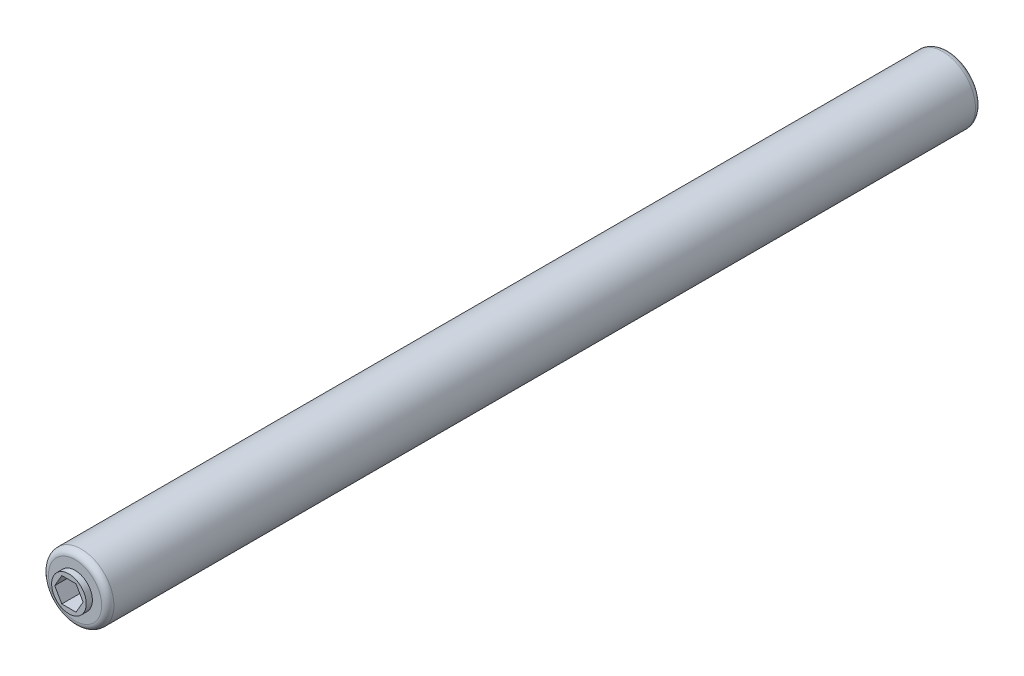
ISO-10303-21;
HEADER;
FILE_DESCRIPTION(('STEP AP214'),'2;1');
FILE_NAME('part.step','',(''),(''),'','','');
FILE_SCHEMA(('AUTOMOTIVE_DESIGN { 1 0 10303 214 1 1 1 1 }'));
ENDSEC;
DATA;
#1=APPLICATION_CONTEXT('core data for automotive mechanical design processes');
#2=APPLICATION_PROTOCOL_DEFINITION('international standard','automotive_design',2000,#1);
#3=PRODUCT_CONTEXT('',#1,'mechanical');
#4=PRODUCT('Part','Part','',(#3));
#5=PRODUCT_RELATED_PRODUCT_CATEGORY('part','',(#4));
#6=PRODUCT_DEFINITION_FORMATION('','',#4);
#7=PRODUCT_DEFINITION_CONTEXT('part definition',#1,'design');
#8=PRODUCT_DEFINITION('design','',#6,#7);
#9=PRODUCT_DEFINITION_SHAPE('','',#8);
#10=(LENGTH_UNIT() NAMED_UNIT(*) SI_UNIT(.MILLI.,.METRE.));
#11=(NAMED_UNIT(*) PLANE_ANGLE_UNIT() SI_UNIT($,.RADIAN.));
#12=(NAMED_UNIT(*) SI_UNIT($,.STERADIAN.) SOLID_ANGLE_UNIT());
#13=UNCERTAINTY_MEASURE_WITH_UNIT(LENGTH_MEASURE(1.E-05),#10,'distance_accuracy_value','');
#14=(GEOMETRIC_REPRESENTATION_CONTEXT(3) GLOBAL_UNCERTAINTY_ASSIGNED_CONTEXT((#13)) GLOBAL_UNIT_ASSIGNED_CONTEXT((#10,
#11,#12)) REPRESENTATION_CONTEXT('',''));
#15=CARTESIAN_POINT('',(0.,0.,0.));
#16=DIRECTION('',(0.,0.,1.));
#17=DIRECTION('',(1.,0.,0.));
#18=AXIS2_PLACEMENT_3D('',#15,#16,#17);
#19=CARTESIAN_POINT('',(0.,0.,-228.6));
#20=DIRECTION('',(0.,0.,1.));
#21=DIRECTION('',(1.,0.,0.));
#22=AXIS2_PLACEMENT_3D('',#19,#20,#21);
#23=PLANE('',#22);
#24=DIRECTION('',(1.,0.,0.));
#25=VECTOR('',#24,1.);
#26=CARTESIAN_POINT('',(-3.66617420935412,-6.35,-228.6));
#27=LINE('',#26,#25);
#28=CARTESIAN_POINT('',(-3.66617420935412,-6.35,-228.6));
#29=VERTEX_POINT('',#28);
#30=CARTESIAN_POINT('',(3.66617420935413,-6.35,-228.6));
#31=VERTEX_POINT('',#30);
#32=EDGE_CURVE('E100',#29,#31,#27,.T.);
#33=ORIENTED_EDGE('',*,*,#32,.T.);
#34=DIRECTION('',(0.5,0.866025403784439,0.));
#35=VECTOR('',#34,1.);
#36=CARTESIAN_POINT('',(3.66617420935413,-6.35,-228.6));
#37=LINE('',#36,#35);
#38=CARTESIAN_POINT('',(7.33234841870825,0.,-228.6));
#39=VERTEX_POINT('',#38);
#40=EDGE_CURVE('E94',#31,#39,#37,.T.);
#41=ORIENTED_EDGE('',*,*,#40,.T.);
#42=DIRECTION('',(-0.5,0.866025403784438,0.));
#43=VECTOR('',#42,1.);
#44=CARTESIAN_POINT('',(7.33234841870825,0.,-228.6));
#45=LINE('',#44,#43);
#46=CARTESIAN_POINT('',(3.66617420935412,6.35,-228.6));
#47=VERTEX_POINT('',#46);
#48=EDGE_CURVE('E103',#39,#47,#45,.T.);
#49=ORIENTED_EDGE('',*,*,#48,.T.);
#50=DIRECTION('',(-1.,0.,0.));
#51=VECTOR('',#50,1.);
#52=CARTESIAN_POINT('',(3.66617420935412,6.35,-228.6));
#53=LINE('',#52,#51);
#54=CARTESIAN_POINT('',(-3.66617420935412,6.35,-228.6));
#55=VERTEX_POINT('',#54);
#56=EDGE_CURVE('E54',#47,#55,#53,.T.);
#57=ORIENTED_EDGE('',*,*,#56,.T.);
#58=DIRECTION('',(-0.5,-0.866025403784439,0.));
#59=VECTOR('',#58,1.);
#60=CARTESIAN_POINT('',(-3.66617420935412,6.35,-228.6));
#61=LINE('',#60,#59);
#62=CARTESIAN_POINT('',(-7.33234841870825,0.,-228.6));
#63=VERTEX_POINT('',#62);
#64=EDGE_CURVE('E117',#55,#63,#61,.T.);
#65=ORIENTED_EDGE('',*,*,#64,.T.);
#66=DIRECTION('',(0.5,-0.866025403784439,0.));
#67=VECTOR('',#66,1.);
#68=CARTESIAN_POINT('',(-7.33234841870825,0.,-228.6));
#69=LINE('',#68,#67);
#70=EDGE_CURVE('E120',#63,#29,#69,.T.);
#71=ORIENTED_EDGE('',*,*,#70,.T.);
#72=EDGE_LOOP('',(#33,#41,#49,#57,#65,#71));
#73=FACE_BOUND('',#72,.T.);
#74=CARTESIAN_POINT('',(0.,0.,-228.6));
#75=DIRECTION('',(0.,0.,1.));
#76=DIRECTION('',(1.,0.,0.));
#77=AXIS2_PLACEMENT_3D('',#74,#75,#76);
#78=CIRCLE('',#77,8.9296875);
#79=CARTESIAN_POINT('',(8.9296875,0.,-228.6));
#80=VERTEX_POINT('',#79);
#81=EDGE_CURVE('E148',#80,#80,#78,.T.);
#82=ORIENTED_EDGE('',*,*,#81,.F.);
#83=EDGE_LOOP('',(#82));
#84=FACE_BOUND('',#83,.T.);
#85=ADVANCED_FACE('F39',(#73,#84),#23,.F.);
#86=CARTESIAN_POINT('',(0.,0.,0.));
#87=DIRECTION('',(0.,0.,1.));
#88=DIRECTION('',(1.,0.,0.));
#89=AXIS2_PLACEMENT_3D('',#86,#87,#88);
#90=CYLINDRICAL_SURFACE('',#89,8.9296875);
#91=CARTESIAN_POINT('',(0.,0.,-225.425));
#92=DIRECTION('',(0.,0.,1.));
#93=DIRECTION('',(1.,0.,0.));
#94=AXIS2_PLACEMENT_3D('',#91,#92,#93);
#95=CIRCLE('',#94,8.9296875);
#96=CARTESIAN_POINT('',(8.9296875,0.,-225.425));
#97=VERTEX_POINT('',#96);
#98=EDGE_CURVE('E136',#97,#97,#95,.T.);
#99=ORIENTED_EDGE('',*,*,#98,.F.);
#100=EDGE_LOOP('',(#99));
#101=FACE_BOUND('',#100,.T.);
#102=ORIENTED_EDGE('',*,*,#81,.T.);
#103=EDGE_LOOP('',(#102));
#104=FACE_BOUND('',#103,.T.);
#105=ADVANCED_FACE('F190',(#101,#104),#90,.T.);
#106=CARTESIAN_POINT('',(16.8671875,0.,-225.425));
#107=DIRECTION('',(0.,0.,1.));
#108=DIRECTION('',(1.,0.,0.));
#109=AXIS2_PLACEMENT_3D('',#106,#107,#108);
#110=PLANE('',#109);
#111=CARTESIAN_POINT('',(0.,0.,-225.425));
#112=DIRECTION('',(0.,0.,1.));
#113=DIRECTION('',(1.,0.,0.));
#114=AXIS2_PLACEMENT_3D('',#111,#112,#113);
#115=CIRCLE('',#114,13.6921875);
#116=CARTESIAN_POINT('',(13.6921875,0.,-225.425));
#117=VERTEX_POINT('',#116);
#118=EDGE_CURVE('E11',#117,#117,#115,.F.);
#119=ORIENTED_EDGE('',*,*,#118,.T.);
#120=EDGE_LOOP('',(#119));
#121=FACE_BOUND('',#120,.T.);
#122=ORIENTED_EDGE('',*,*,#98,.T.);
#123=EDGE_LOOP('',(#122));
#124=FACE_BOUND('',#123,.T.);
#125=ADVANCED_FACE('F195',(#121,#124),#110,.F.);
#126=CARTESIAN_POINT('',(0.,0.,228.6));
#127=DIRECTION('',(0.,0.,-1.));
#128=DIRECTION('',(-1.,0.,0.));
#129=AXIS2_PLACEMENT_3D('',#126,#127,#128);
#130=CYLINDRICAL_SURFACE('',#129,16.8671875);
#131=CARTESIAN_POINT('',(0.,0.,222.25));
#132=DIRECTION('',(0.,0.,-1.));
#133=DIRECTION('',(-1.,0.,0.));
#134=AXIS2_PLACEMENT_3D('',#131,#132,#133);
#135=CIRCLE('',#134,16.8671875);
#136=CARTESIAN_POINT('',(-16.8671875,0.,222.25));
#137=VERTEX_POINT('',#136);
#138=EDGE_CURVE('E47',#137,#137,#135,.T.);
#139=ORIENTED_EDGE('',*,*,#138,.T.);
#140=EDGE_LOOP('',(#139));
#141=FACE_BOUND('',#140,.T.);
#142=CARTESIAN_POINT('',(0.,0.,-222.25));
#143=DIRECTION('',(0.,0.,1.));
#144=DIRECTION('',(1.,0.,0.));
#145=AXIS2_PLACEMENT_3D('',#142,#143,#144);
#146=CIRCLE('',#145,16.8671875);
#147=CARTESIAN_POINT('',(16.8671875,0.,-222.25));
#148=VERTEX_POINT('',#147);
#149=EDGE_CURVE('E158',#148,#148,#146,.T.);
#150=ORIENTED_EDGE('',*,*,#149,.T.);
#151=EDGE_LOOP('',(#150));
#152=FACE_BOUND('',#151,.T.);
#153=ADVANCED_FACE('F163',(#141,#152),#130,.T.);
#154=CARTESIAN_POINT('',(16.8671875,0.,225.425));
#155=DIRECTION('',(0.,0.,-1.));
#156=DIRECTION('',(-1.,0.,0.));
#157=AXIS2_PLACEMENT_3D('',#154,#155,#156);
#158=PLANE('',#157);
#159=CARTESIAN_POINT('',(0.,0.,225.425));
#160=DIRECTION('',(0.,0.,-1.));
#161=DIRECTION('',(-1.,0.,0.));
#162=AXIS2_PLACEMENT_3D('',#159,#160,#161);
#163=CIRCLE('',#162,13.6921875);
#164=CARTESIAN_POINT('',(-13.6921875,0.,225.425));
#165=VERTEX_POINT('',#164);
#166=EDGE_CURVE('E151',#165,#165,#163,.F.);
#167=ORIENTED_EDGE('',*,*,#166,.T.);
#168=EDGE_LOOP('',(#167));
#169=FACE_BOUND('',#168,.T.);
#170=CARTESIAN_POINT('',(0.,0.,225.425));
#171=DIRECTION('',(0.,0.,1.));
#172=DIRECTION('',(1.,0.,0.));
#173=AXIS2_PLACEMENT_3D('',#170,#171,#172);
#174=CIRCLE('',#173,8.9296875);
#175=CARTESIAN_POINT('',(8.9296875,0.,225.425));
#176=VERTEX_POINT('',#175);
#177=EDGE_CURVE('E147',#176,#176,#174,.T.);
#178=ORIENTED_EDGE('',*,*,#177,.F.);
#179=EDGE_LOOP('',(#178));
#180=FACE_BOUND('',#179,.T.);
#181=ADVANCED_FACE('F172',(#169,#180),#158,.F.);
#182=CARTESIAN_POINT('',(0.,0.,0.));
#183=DIRECTION('',(0.,0.,1.));
#184=DIRECTION('',(1.,0.,0.));
#185=AXIS2_PLACEMENT_3D('',#182,#183,#184);
#186=CYLINDRICAL_SURFACE('',#185,8.9296875);
#187=CARTESIAN_POINT('',(0.,0.,228.6));
#188=DIRECTION('',(0.,0.,1.));
#189=DIRECTION('',(1.,0.,0.));
#190=AXIS2_PLACEMENT_3D('',#187,#188,#189);
#191=CIRCLE('',#190,8.9296875);
#192=CARTESIAN_POINT('',(8.9296875,0.,228.6));
#193=VERTEX_POINT('',#192);
#194=EDGE_CURVE('E144',#193,#193,#191,.T.);
#195=ORIENTED_EDGE('',*,*,#194,.F.);
#196=EDGE_LOOP('',(#195));
#197=FACE_BOUND('',#196,.T.);
#198=ORIENTED_EDGE('',*,*,#177,.T.);
#199=EDGE_LOOP('',(#198));
#200=FACE_BOUND('',#199,.T.);
#201=ADVANCED_FACE('F175',(#197,#200),#186,.T.);
#202=CARTESIAN_POINT('',(0.,0.,228.6));
#203=DIRECTION('',(0.,0.,1.));
#204=DIRECTION('',(1.,0.,0.));
#205=AXIS2_PLACEMENT_3D('',#202,#203,#204);
#206=PLANE('',#205);
#207=DIRECTION('',(0.5,0.866025403784439,0.));
#208=VECTOR('',#207,1.);
#209=CARTESIAN_POINT('',(3.66617420935413,-6.35,228.6));
#210=LINE('',#209,#208);
#211=CARTESIAN_POINT('',(3.66617420935413,-6.35,228.6));
#212=VERTEX_POINT('',#211);
#213=CARTESIAN_POINT('',(7.33234841870825,0.,228.6));
#214=VERTEX_POINT('',#213);
#215=EDGE_CURVE('E62',#212,#214,#210,.T.);
#216=ORIENTED_EDGE('',*,*,#215,.F.);
#217=DIRECTION('',(1.,0.,0.));
#218=VECTOR('',#217,1.);
#219=CARTESIAN_POINT('',(-3.66617420935412,-6.35,228.6));
#220=LINE('',#219,#218);
#221=CARTESIAN_POINT('',(-3.66617420935412,-6.35,228.6));
#222=VERTEX_POINT('',#221);
#223=EDGE_CURVE('E110',#222,#212,#220,.T.);
#224=ORIENTED_EDGE('',*,*,#223,.F.);
#225=DIRECTION('',(0.5,-0.866025403784439,0.));
#226=VECTOR('',#225,1.);
#227=CARTESIAN_POINT('',(-7.33234841870825,0.,228.6));
#228=LINE('',#227,#226);
#229=CARTESIAN_POINT('',(-7.33234841870825,0.,228.6));
#230=VERTEX_POINT('',#229);
#231=EDGE_CURVE('E113',#230,#222,#228,.T.);
#232=ORIENTED_EDGE('',*,*,#231,.F.);
#233=DIRECTION('',(-0.5,-0.866025403784439,0.));
#234=VECTOR('',#233,1.);
#235=CARTESIAN_POINT('',(-3.66617420935412,6.35,228.6));
#236=LINE('',#235,#234);
#237=CARTESIAN_POINT('',(-3.66617420935412,6.35,228.6));
#238=VERTEX_POINT('',#237);
#239=EDGE_CURVE('E129',#238,#230,#236,.T.);
#240=ORIENTED_EDGE('',*,*,#239,.F.);
#241=DIRECTION('',(-1.,0.,0.));
#242=VECTOR('',#241,1.);
#243=CARTESIAN_POINT('',(3.66617420935412,6.35,228.6));
#244=LINE('',#243,#242);
#245=CARTESIAN_POINT('',(3.66617420935412,6.35,228.6));
#246=VERTEX_POINT('',#245);
#247=EDGE_CURVE('E126',#246,#238,#244,.T.);
#248=ORIENTED_EDGE('',*,*,#247,.F.);
#249=DIRECTION('',(-0.5,0.866025403784438,0.));
#250=VECTOR('',#249,1.);
#251=CARTESIAN_POINT('',(7.33234841870825,0.,228.6));
#252=LINE('',#251,#250);
#253=EDGE_CURVE('E124',#214,#246,#252,.T.);
#254=ORIENTED_EDGE('',*,*,#253,.F.);
#255=EDGE_LOOP('',(#216,#224,#232,#240,#248,#254));
#256=FACE_BOUND('',#255,.T.);
#257=ORIENTED_EDGE('',*,*,#194,.T.);
#258=EDGE_LOOP('',(#257));
#259=FACE_BOUND('',#258,.T.);
#260=ADVANCED_FACE('F169',(#256,#259),#206,.T.);
#261=CARTESIAN_POINT('',(0.,0.,222.25));
#262=DIRECTION('',(0.,0.,-1.));
#263=DIRECTION('',(-1.,0.,0.));
#264=AXIS2_PLACEMENT_3D('',#261,#262,#263);
#265=TOROIDAL_SURFACE('',#264,13.6921875,3.175);
#266=ORIENTED_EDGE('',*,*,#138,.F.);
#267=EDGE_LOOP('',(#266));
#268=FACE_BOUND('',#267,.T.);
#269=ORIENTED_EDGE('',*,*,#166,.F.);
#270=EDGE_LOOP('',(#269));
#271=FACE_BOUND('',#270,.T.);
#272=ADVANCED_FACE('F166',(#268,#271),#265,.T.);
#273=CARTESIAN_POINT('',(0.,0.,-222.25));
#274=DIRECTION('',(0.,0.,1.));
#275=DIRECTION('',(1.,0.,0.));
#276=AXIS2_PLACEMENT_3D('',#273,#274,#275);
#277=TOROIDAL_SURFACE('',#276,13.6921875,3.175);
#278=ORIENTED_EDGE('',*,*,#118,.F.);
#279=EDGE_LOOP('',(#278));
#280=FACE_BOUND('',#279,.T.);
#281=ORIENTED_EDGE('',*,*,#149,.F.);
#282=EDGE_LOOP('',(#281));
#283=FACE_BOUND('',#282,.T.);
#284=ADVANCED_FACE('F41',(#280,#283),#277,.T.);
#285=CARTESIAN_POINT('',(3.66617420935413,-6.35,-228.6));
#286=DIRECTION('',(0.866025403784439,-0.5,0.));
#287=DIRECTION('',(0.5,0.866025403784439,0.));
#288=AXIS2_PLACEMENT_3D('',#285,#286,#287);
#289=PLANE('',#288);
#290=ORIENTED_EDGE('',*,*,#215,.T.);
#291=DIRECTION('',(0.,0.,1.));
#292=VECTOR('',#291,1.);
#293=CARTESIAN_POINT('',(7.33234841870825,0.,-228.6));
#294=LINE('',#293,#292);
#295=EDGE_CURVE('E90',#39,#214,#294,.T.);
#296=ORIENTED_EDGE('',*,*,#295,.F.);
#297=ORIENTED_EDGE('',*,*,#40,.F.);
#298=DIRECTION('',(0.,0.,1.));
#299=VECTOR('',#298,1.);
#300=CARTESIAN_POINT('',(3.66617420935413,-6.35,-228.6));
#301=LINE('',#300,#299);
#302=EDGE_CURVE('E134',#31,#212,#301,.T.);
#303=ORIENTED_EDGE('',*,*,#302,.T.);
#304=EDGE_LOOP('',(#290,#296,#297,#303));
#305=FACE_BOUND('',#304,.T.);
#306=ADVANCED_FACE('F92',(#305),#289,.F.);
#307=CARTESIAN_POINT('',(-3.66617420935412,-6.35,-228.6));
#308=DIRECTION('',(0.,-1.,0.));
#309=DIRECTION('',(1.,0.,0.));
#310=AXIS2_PLACEMENT_3D('',#307,#308,#309);
#311=PLANE('',#310);
#312=ORIENTED_EDGE('',*,*,#223,.T.);
#313=ORIENTED_EDGE('',*,*,#302,.F.);
#314=ORIENTED_EDGE('',*,*,#32,.F.);
#315=DIRECTION('',(0.,0.,1.));
#316=VECTOR('',#315,1.);
#317=CARTESIAN_POINT('',(-3.66617420935412,-6.35,-228.6));
#318=LINE('',#317,#316);
#319=EDGE_CURVE('E137',#29,#222,#318,.T.);
#320=ORIENTED_EDGE('',*,*,#319,.T.);
#321=EDGE_LOOP('',(#312,#313,#314,#320));
#322=FACE_BOUND('',#321,.T.);
#323=ADVANCED_FACE('F219',(#322),#311,.F.);
#324=CARTESIAN_POINT('',(-7.33234841870825,0.,-228.6));
#325=DIRECTION('',(-0.866025403784439,-0.5,0.));
#326=DIRECTION('',(0.5,-0.866025403784439,0.));
#327=AXIS2_PLACEMENT_3D('',#324,#325,#326);
#328=PLANE('',#327);
#329=ORIENTED_EDGE('',*,*,#231,.T.);
#330=ORIENTED_EDGE('',*,*,#319,.F.);
#331=ORIENTED_EDGE('',*,*,#70,.F.);
#332=DIRECTION('',(0.,0.,1.));
#333=VECTOR('',#332,1.);
#334=CARTESIAN_POINT('',(-7.33234841870825,0.,-228.6));
#335=LINE('',#334,#333);
#336=EDGE_CURVE('E139',#63,#230,#335,.T.);
#337=ORIENTED_EDGE('',*,*,#336,.T.);
#338=EDGE_LOOP('',(#329,#330,#331,#337));
#339=FACE_BOUND('',#338,.T.);
#340=ADVANCED_FACE('F223',(#339),#328,.F.);
#341=CARTESIAN_POINT('',(-3.66617420935412,6.35,-228.6));
#342=DIRECTION('',(-0.866025403784439,0.5,0.));
#343=DIRECTION('',(-0.5,-0.866025403784439,0.));
#344=AXIS2_PLACEMENT_3D('',#341,#342,#343);
#345=PLANE('',#344);
#346=ORIENTED_EDGE('',*,*,#239,.T.);
#347=ORIENTED_EDGE('',*,*,#336,.F.);
#348=ORIENTED_EDGE('',*,*,#64,.F.);
#349=DIRECTION('',(0.,0.,1.));
#350=VECTOR('',#349,1.);
#351=CARTESIAN_POINT('',(-3.66617420935412,6.35,-228.6));
#352=LINE('',#351,#350);
#353=EDGE_CURVE('E141',#55,#238,#352,.T.);
#354=ORIENTED_EDGE('',*,*,#353,.T.);
#355=EDGE_LOOP('',(#346,#347,#348,#354));
#356=FACE_BOUND('',#355,.T.);
#357=ADVANCED_FACE('F232',(#356),#345,.F.);
#358=CARTESIAN_POINT('',(3.66617420935412,6.35,-228.6));
#359=DIRECTION('',(0.,1.,0.));
#360=DIRECTION('',(0.,0.,1.));
#361=AXIS2_PLACEMENT_3D('',#358,#359,#360);
#362=PLANE('',#361);
#363=ORIENTED_EDGE('',*,*,#247,.T.);
#364=ORIENTED_EDGE('',*,*,#353,.F.);
#365=ORIENTED_EDGE('',*,*,#56,.F.);
#366=DIRECTION('',(0.,0.,1.));
#367=VECTOR('',#366,1.);
#368=CARTESIAN_POINT('',(3.66617420935412,6.35,-228.6));
#369=LINE('',#368,#367);
#370=EDGE_CURVE('E99',#47,#246,#369,.T.);
#371=ORIENTED_EDGE('',*,*,#370,.T.);
#372=EDGE_LOOP('',(#363,#364,#365,#371));
#373=FACE_BOUND('',#372,.T.);
#374=ADVANCED_FACE('F229',(#373),#362,.F.);
#375=CARTESIAN_POINT('',(7.33234841870825,0.,-228.6));
#376=DIRECTION('',(0.866025403784438,0.5,0.));
#377=DIRECTION('',(-0.5,0.866025403784439,0.));
#378=AXIS2_PLACEMENT_3D('',#375,#376,#377);
#379=PLANE('',#378);
#380=ORIENTED_EDGE('',*,*,#253,.T.);
#381=ORIENTED_EDGE('',*,*,#370,.F.);
#382=ORIENTED_EDGE('',*,*,#48,.F.);
#383=ORIENTED_EDGE('',*,*,#295,.T.);
#384=EDGE_LOOP('',(#380,#381,#382,#383));
#385=FACE_BOUND('',#384,.T.);
#386=ADVANCED_FACE('F104',(#385),#379,.F.);
#387=CLOSED_SHELL('',(#85,#105,#125,#153,#181,#201,#260,#272,#284,#306,#323,#340,#357,#374,#386));
#388=MANIFOLD_SOLID_BREP('B2',#387);
#389=ADVANCED_BREP_SHAPE_REPRESENTATION('',(#18,#388),#14);
#390=SHAPE_DEFINITION_REPRESENTATION(#9,#389);
ENDSEC;
END-ISO-10303-21;
